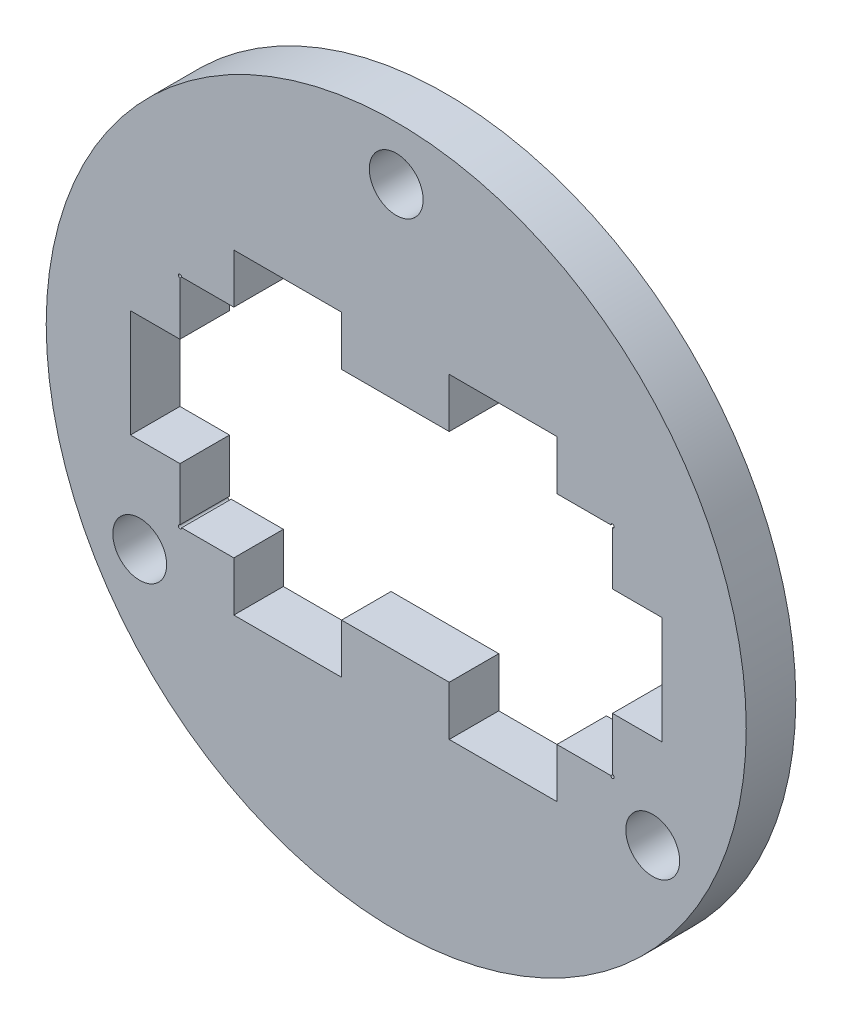
ISO-10303-21;
HEADER;
FILE_DESCRIPTION(('STEP AP214'),'2;1');
FILE_NAME('part.step','',(''),(''),'','','');
FILE_SCHEMA(('AUTOMOTIVE_DESIGN { 1 0 10303 214 1 1 1 1 }'));
ENDSEC;
DATA;
#1=APPLICATION_CONTEXT('core data for automotive mechanical design processes');
#2=APPLICATION_PROTOCOL_DEFINITION('international standard','automotive_design',2000,#1);
#3=PRODUCT_CONTEXT('',#1,'mechanical');
#4=PRODUCT('Part','Part','',(#3));
#5=PRODUCT_RELATED_PRODUCT_CATEGORY('part','',(#4));
#6=PRODUCT_DEFINITION_FORMATION('','',#4);
#7=PRODUCT_DEFINITION_CONTEXT('part definition',#1,'design');
#8=PRODUCT_DEFINITION('design','',#6,#7);
#9=PRODUCT_DEFINITION_SHAPE('','',#8);
#10=(LENGTH_UNIT() NAMED_UNIT(*) SI_UNIT(.MILLI.,.METRE.));
#11=(NAMED_UNIT(*) PLANE_ANGLE_UNIT() SI_UNIT($,.RADIAN.));
#12=(NAMED_UNIT(*) SI_UNIT($,.STERADIAN.) SOLID_ANGLE_UNIT());
#13=UNCERTAINTY_MEASURE_WITH_UNIT(LENGTH_MEASURE(1.E-05),#10,'distance_accuracy_value','');
#14=(GEOMETRIC_REPRESENTATION_CONTEXT(3) GLOBAL_UNCERTAINTY_ASSIGNED_CONTEXT((#13)) GLOBAL_UNIT_ASSIGNED_CONTEXT((#10,
#11,#12)) REPRESENTATION_CONTEXT('',''));
#15=CARTESIAN_POINT('',(0.,0.,0.));
#16=DIRECTION('',(0.,0.,1.));
#17=DIRECTION('',(1.,0.,0.));
#18=AXIS2_PLACEMENT_3D('',#15,#16,#17);
#19=CARTESIAN_POINT('',(-25.5,0.,5.842));
#20=DIRECTION('',(-1.,0.,0.));
#21=DIRECTION('',(0.,0.,1.));
#22=AXIS2_PLACEMENT_3D('',#19,#20,#21);
#23=PLANE('',#22);
#24=DIRECTION('',(0.,1.,0.));
#25=VECTOR('',#24,1.);
#26=CARTESIAN_POINT('',(-25.5,0.,0.));
#27=LINE('',#26,#25);
#28=CARTESIAN_POINT('',(-25.5,-12.6015625,0.));
#29=VERTEX_POINT('',#28);
#30=CARTESIAN_POINT('',(-25.5,-6.34999999999999,0.));
#31=VERTEX_POINT('',#30);
#32=EDGE_CURVE('E458',#29,#31,#27,.T.);
#33=ORIENTED_EDGE('',*,*,#32,.T.);
#34=DIRECTION('',(0.,0.,-1.));
#35=VECTOR('',#34,1.);
#36=CARTESIAN_POINT('',(-25.5,-6.34999999999999,5.842));
#37=LINE('',#36,#35);
#38=CARTESIAN_POINT('',(-25.5,-6.34999999999999,5.842));
#39=VERTEX_POINT('',#38);
#40=EDGE_CURVE('E284',#39,#31,#37,.T.);
#41=ORIENTED_EDGE('',*,*,#40,.F.);
#42=DIRECTION('',(0.,1.,0.));
#43=VECTOR('',#42,1.);
#44=CARTESIAN_POINT('',(-25.5,0.,5.842));
#45=LINE('',#44,#43);
#46=CARTESIAN_POINT('',(-25.5,-12.6015625,5.842));
#47=VERTEX_POINT('',#46);
#48=EDGE_CURVE('E420',#47,#39,#45,.T.);
#49=ORIENTED_EDGE('',*,*,#48,.F.);
#50=DIRECTION('',(0.,0.,-1.));
#51=VECTOR('',#50,1.);
#52=CARTESIAN_POINT('',(-25.5,-12.6015625,5.842));
#53=LINE('',#52,#51);
#54=EDGE_CURVE('E11',#47,#29,#53,.T.);
#55=ORIENTED_EDGE('',*,*,#54,.T.);
#56=EDGE_LOOP('',(#33,#41,#49,#55));
#57=FACE_BOUND('',#56,.T.);
#58=ADVANCED_FACE('F41',(#57),#23,.F.);
#59=CARTESIAN_POINT('',(25.5,0.,5.842));
#60=DIRECTION('',(-1.,0.,0.));
#61=DIRECTION('',(0.,0.,1.));
#62=AXIS2_PLACEMENT_3D('',#59,#60,#61);
#63=PLANE('',#62);
#64=DIRECTION('',(0.,0.,-1.));
#65=VECTOR('',#64,1.);
#66=CARTESIAN_POINT('',(25.5,-6.35,5.842));
#67=LINE('',#66,#65);
#68=CARTESIAN_POINT('',(25.5,-6.35,5.842));
#69=VERTEX_POINT('',#68);
#70=CARTESIAN_POINT('',(25.5,-6.35,0.));
#71=VERTEX_POINT('',#70);
#72=EDGE_CURVE('E302',#69,#71,#67,.T.);
#73=ORIENTED_EDGE('',*,*,#72,.T.);
#74=DIRECTION('',(0.,1.,0.));
#75=VECTOR('',#74,1.);
#76=CARTESIAN_POINT('',(25.5,0.,0.));
#77=LINE('',#76,#75);
#78=CARTESIAN_POINT('',(25.5,-12.6015625,0.));
#79=VERTEX_POINT('',#78);
#80=EDGE_CURVE('E473',#79,#71,#77,.T.);
#81=ORIENTED_EDGE('',*,*,#80,.F.);
#82=DIRECTION('',(0.,0.,-1.));
#83=VECTOR('',#82,1.);
#84=CARTESIAN_POINT('',(25.5,-12.6015625,5.842));
#85=LINE('',#84,#83);
#86=CARTESIAN_POINT('',(25.5,-12.6015625,5.842));
#87=VERTEX_POINT('',#86);
#88=EDGE_CURVE('E496',#87,#79,#85,.T.);
#89=ORIENTED_EDGE('',*,*,#88,.F.);
#90=DIRECTION('',(0.,1.,0.));
#91=VECTOR('',#90,1.);
#92=CARTESIAN_POINT('',(25.5,0.,5.842));
#93=LINE('',#92,#91);
#94=EDGE_CURVE('E434',#87,#69,#93,.T.);
#95=ORIENTED_EDGE('',*,*,#94,.T.);
#96=EDGE_LOOP('',(#73,#81,#89,#95));
#97=FACE_BOUND('',#96,.T.);
#98=ADVANCED_FACE('F533',(#97),#63,.T.);
#99=CARTESIAN_POINT('',(0.,-12.8,5.842));
#100=DIRECTION('',(0.,1.,0.));
#101=DIRECTION('',(0.,0.,1.));
#102=AXIS2_PLACEMENT_3D('',#99,#100,#101);
#103=PLANE('',#102);
#104=DIRECTION('',(0.,0.,-1.));
#105=VECTOR('',#104,1.);
#106=CARTESIAN_POINT('',(18.9499969420604,-12.8,5.842));
#107=LINE('',#106,#105);
#108=CARTESIAN_POINT('',(18.9499969420604,-12.8,5.842));
#109=VERTEX_POINT('',#108);
#110=CARTESIAN_POINT('',(18.9499969420604,-12.8,0.));
#111=VERTEX_POINT('',#110);
#112=EDGE_CURVE('E328',#109,#111,#107,.T.);
#113=ORIENTED_EDGE('',*,*,#112,.F.);
#114=DIRECTION('',(1.,0.,0.));
#115=VECTOR('',#114,1.);
#116=CARTESIAN_POINT('',(0.,-12.8,5.842));
#117=LINE('',#116,#115);
#118=CARTESIAN_POINT('',(25.3015625,-12.8,5.842));
#119=VERTEX_POINT('',#118);
#120=EDGE_CURVE('E440',#109,#119,#117,.T.);
#121=ORIENTED_EDGE('',*,*,#120,.T.);
#122=DIRECTION('',(0.,0.,-1.));
#123=VECTOR('',#122,1.);
#124=CARTESIAN_POINT('',(25.3015625,-12.8,5.842));
#125=LINE('',#124,#123);
#126=CARTESIAN_POINT('',(25.3015625,-12.8,0.));
#127=VERTEX_POINT('',#126);
#128=EDGE_CURVE('E493',#119,#127,#125,.T.);
#129=ORIENTED_EDGE('',*,*,#128,.T.);
#130=DIRECTION('',(1.,0.,0.));
#131=VECTOR('',#130,1.);
#132=CARTESIAN_POINT('',(0.,-12.8,0.));
#133=LINE('',#132,#131);
#134=EDGE_CURVE('E479',#111,#127,#133,.T.);
#135=ORIENTED_EDGE('',*,*,#134,.F.);
#136=EDGE_LOOP('',(#113,#121,#129,#135));
#137=FACE_BOUND('',#136,.T.);
#138=ADVANCED_FACE('F538',(#137),#103,.T.);
#139=CARTESIAN_POINT('',(0.,12.8,5.842));
#140=DIRECTION('',(0.,1.,0.));
#141=DIRECTION('',(0.,0.,1.));
#142=AXIS2_PLACEMENT_3D('',#139,#140,#141);
#143=PLANE('',#142);
#144=DIRECTION('',(1.,0.,0.));
#145=VECTOR('',#144,1.);
#146=CARTESIAN_POINT('',(0.,12.8,0.));
#147=LINE('',#146,#145);
#148=CARTESIAN_POINT('',(-6.45000305793958,12.8,0.));
#149=VERTEX_POINT('',#148);
#150=CARTESIAN_POINT('',(6.24999694206041,12.8,0.));
#151=VERTEX_POINT('',#150);
#152=EDGE_CURVE('E469',#149,#151,#147,.T.);
#153=ORIENTED_EDGE('',*,*,#152,.T.);
#154=DIRECTION('',(0.,0.,-1.));
#155=VECTOR('',#154,1.);
#156=CARTESIAN_POINT('',(6.24999694206041,12.8,5.842));
#157=LINE('',#156,#155);
#158=CARTESIAN_POINT('',(6.24999694206041,12.8,5.842));
#159=VERTEX_POINT('',#158);
#160=EDGE_CURVE('E354',#159,#151,#157,.T.);
#161=ORIENTED_EDGE('',*,*,#160,.F.);
#162=DIRECTION('',(1.,0.,0.));
#163=VECTOR('',#162,1.);
#164=CARTESIAN_POINT('',(0.,12.8,5.842));
#165=LINE('',#164,#163);
#166=CARTESIAN_POINT('',(-6.45000305793958,12.8,5.842));
#167=VERTEX_POINT('',#166);
#168=EDGE_CURVE('E430',#167,#159,#165,.T.);
#169=ORIENTED_EDGE('',*,*,#168,.F.);
#170=DIRECTION('',(0.,0.,-1.));
#171=VECTOR('',#170,1.);
#172=CARTESIAN_POINT('',(-6.45000305793958,12.8,5.842));
#173=LINE('',#172,#171);
#174=EDGE_CURVE('E409',#167,#149,#173,.T.);
#175=ORIENTED_EDGE('',*,*,#174,.T.);
#176=EDGE_LOOP('',(#153,#161,#169,#175));
#177=FACE_BOUND('',#176,.T.);
#178=ADVANCED_FACE('F611',(#177),#143,.F.);
#179=DIRECTION('',(0.,0.,-1.));
#180=VECTOR('',#179,1.);
#181=CARTESIAN_POINT('',(-19.1500030579396,-12.8,5.842));
#182=LINE('',#181,#180);
#183=CARTESIAN_POINT('',(-19.1500030579396,-12.8,5.842));
#184=VERTEX_POINT('',#183);
#185=CARTESIAN_POINT('',(-19.1500030579396,-12.8,0.));
#186=VERTEX_POINT('',#185);
#187=EDGE_CURVE('E373',#184,#186,#182,.T.);
#188=ORIENTED_EDGE('',*,*,#187,.T.);
#189=CARTESIAN_POINT('',(-25.3015625,-12.8,0.));
#190=VERTEX_POINT('',#189);
#191=EDGE_CURVE('E480',#190,#186,#133,.T.);
#192=ORIENTED_EDGE('',*,*,#191,.F.);
#193=DIRECTION('',(0.,0.,-1.));
#194=VECTOR('',#193,1.);
#195=CARTESIAN_POINT('',(-25.3015625,-12.8,5.842));
#196=LINE('',#195,#194);
#197=CARTESIAN_POINT('',(-25.3015625,-12.8,5.842));
#198=VERTEX_POINT('',#197);
#199=EDGE_CURVE('E454',#198,#190,#196,.T.);
#200=ORIENTED_EDGE('',*,*,#199,.F.);
#201=EDGE_CURVE('E441',#198,#184,#117,.T.);
#202=ORIENTED_EDGE('',*,*,#201,.T.);
#203=EDGE_LOOP('',(#188,#192,#200,#202));
#204=FACE_BOUND('',#203,.T.);
#205=ADVANCED_FACE('F551',(#204),#103,.T.);
#206=CARTESIAN_POINT('',(-25.3015625,12.8,0.));
#207=VERTEX_POINT('',#206);
#208=CARTESIAN_POINT('',(-19.1500030579396,12.8,0.));
#209=VERTEX_POINT('',#208);
#210=EDGE_CURVE('E465',#207,#209,#147,.T.);
#211=ORIENTED_EDGE('',*,*,#210,.T.);
#212=DIRECTION('',(0.,0.,-1.));
#213=VECTOR('',#212,1.);
#214=CARTESIAN_POINT('',(-19.1500030579396,12.8,5.842));
#215=LINE('',#214,#213);
#216=CARTESIAN_POINT('',(-19.1500030579396,12.8,5.842));
#217=VERTEX_POINT('',#216);
#218=EDGE_CURVE('E406',#217,#209,#215,.T.);
#219=ORIENTED_EDGE('',*,*,#218,.F.);
#220=CARTESIAN_POINT('',(-25.3015625,12.8,5.842));
#221=VERTEX_POINT('',#220);
#222=EDGE_CURVE('E426',#221,#217,#165,.T.);
#223=ORIENTED_EDGE('',*,*,#222,.F.);
#224=DIRECTION('',(0.,0.,-1.));
#225=VECTOR('',#224,1.);
#226=CARTESIAN_POINT('',(-25.3015625,12.8,5.842));
#227=LINE('',#226,#225);
#228=EDGE_CURVE('E504',#221,#207,#227,.T.);
#229=ORIENTED_EDGE('',*,*,#228,.T.);
#230=EDGE_LOOP('',(#211,#219,#223,#229));
#231=FACE_BOUND('',#230,.T.);
#232=ADVANCED_FACE('F521',(#231),#143,.F.);
#233=CARTESIAN_POINT('',(0.,0.,5.842));
#234=DIRECTION('',(0.,0.,1.));
#235=DIRECTION('',(1.,0.,0.));
#236=AXIS2_PLACEMENT_3D('',#233,#234,#235);
#237=PLANE('',#236);
#238=DIRECTION('',(-1.,0.,0.));
#239=VECTOR('',#238,1.);
#240=CARTESIAN_POINT('',(-31.342,-6.34999999999999,5.842));
#241=LINE('',#240,#239);
#242=CARTESIAN_POINT('',(-31.342,-6.34999999999999,5.842));
#243=VERTEX_POINT('',#242);
#244=EDGE_CURVE('E258',#39,#243,#241,.T.);
#245=ORIENTED_EDGE('',*,*,#244,.T.);
#246=DIRECTION('',(0.,1.,0.));
#247=VECTOR('',#246,1.);
#248=CARTESIAN_POINT('',(-31.342,-6.34999999999999,5.842));
#249=LINE('',#248,#247);
#250=CARTESIAN_POINT('',(-31.342,6.35,5.842));
#251=VERTEX_POINT('',#250);
#252=EDGE_CURVE('E253',#243,#251,#249,.T.);
#253=ORIENTED_EDGE('',*,*,#252,.T.);
#254=DIRECTION('',(1.,0.,0.));
#255=VECTOR('',#254,1.);
#256=CARTESIAN_POINT('',(-31.342,6.35,5.842));
#257=LINE('',#256,#255);
#258=CARTESIAN_POINT('',(-25.5,6.35,5.842));
#259=VERTEX_POINT('',#258);
#260=EDGE_CURVE('E261',#251,#259,#257,.T.);
#261=ORIENTED_EDGE('',*,*,#260,.T.);
#262=CARTESIAN_POINT('',(-25.5,12.6015625,5.842));
#263=VERTEX_POINT('',#262);
#264=EDGE_CURVE('E418',#259,#263,#45,.T.);
#265=ORIENTED_EDGE('',*,*,#264,.T.);
#266=CARTESIAN_POINT('',(-25.5,12.8,5.842));
#267=DIRECTION('',(0.,0.,1.));
#268=DIRECTION('',(1.,0.,0.));
#269=AXIS2_PLACEMENT_3D('',#266,#267,#268);
#270=CIRCLE('',#269,0.198437499999999);
#271=EDGE_CURVE('E422',#221,#263,#270,.T.);
#272=ORIENTED_EDGE('',*,*,#271,.F.);
#273=ORIENTED_EDGE('',*,*,#222,.T.);
#274=DIRECTION('',(0.,1.,0.));
#275=VECTOR('',#274,1.);
#276=CARTESIAN_POINT('',(-19.1500030579396,12.8,5.842));
#277=LINE('',#276,#275);
#278=CARTESIAN_POINT('',(-19.1500030579396,18.642,5.842));
#279=VERTEX_POINT('',#278);
#280=EDGE_CURVE('E389',#217,#279,#277,.T.);
#281=ORIENTED_EDGE('',*,*,#280,.T.);
#282=DIRECTION('',(1.,0.,0.));
#283=VECTOR('',#282,1.);
#284=CARTESIAN_POINT('',(-19.1500030579396,18.642,5.842));
#285=LINE('',#284,#283);
#286=CARTESIAN_POINT('',(-6.45000305793958,18.642,5.842));
#287=VERTEX_POINT('',#286);
#288=EDGE_CURVE('E392',#279,#287,#285,.T.);
#289=ORIENTED_EDGE('',*,*,#288,.T.);
#290=DIRECTION('',(0.,-1.,0.));
#291=VECTOR('',#290,1.);
#292=CARTESIAN_POINT('',(-6.45000305793958,12.8,5.842));
#293=LINE('',#292,#291);
#294=EDGE_CURVE('E396',#287,#167,#293,.T.);
#295=ORIENTED_EDGE('',*,*,#294,.T.);
#296=ORIENTED_EDGE('',*,*,#168,.T.);
#297=DIRECTION('',(0.,1.,0.));
#298=VECTOR('',#297,1.);
#299=CARTESIAN_POINT('',(6.24999694206041,12.8,5.842));
#300=LINE('',#299,#298);
#301=CARTESIAN_POINT('',(6.24999694206041,18.642,5.842));
#302=VERTEX_POINT('',#301);
#303=EDGE_CURVE('E337',#159,#302,#300,.T.);
#304=ORIENTED_EDGE('',*,*,#303,.T.);
#305=DIRECTION('',(1.,0.,0.));
#306=VECTOR('',#305,1.);
#307=CARTESIAN_POINT('',(18.9499969420604,18.642,5.842));
#308=LINE('',#307,#306);
#309=CARTESIAN_POINT('',(18.9499969420604,18.642,5.842));
#310=VERTEX_POINT('',#309);
#311=EDGE_CURVE('E340',#302,#310,#308,.T.);
#312=ORIENTED_EDGE('',*,*,#311,.T.);
#313=DIRECTION('',(0.,-1.,0.));
#314=VECTOR('',#313,1.);
#315=CARTESIAN_POINT('',(18.9499969420604,12.8,5.842));
#316=LINE('',#315,#314);
#317=CARTESIAN_POINT('',(18.9499969420604,12.8,5.842));
#318=VERTEX_POINT('',#317);
#319=EDGE_CURVE('E344',#310,#318,#316,.T.);
#320=ORIENTED_EDGE('',*,*,#319,.T.);
#321=CARTESIAN_POINT('',(25.3015625,12.8,5.842));
#322=VERTEX_POINT('',#321);
#323=EDGE_CURVE('E425',#318,#322,#165,.T.);
#324=ORIENTED_EDGE('',*,*,#323,.T.);
#325=CARTESIAN_POINT('',(25.5,12.8,5.842));
#326=DIRECTION('',(0.,0.,1.));
#327=DIRECTION('',(1.,0.,0.));
#328=AXIS2_PLACEMENT_3D('',#325,#326,#327);
#329=CIRCLE('',#328,0.198437499999999);
#330=CARTESIAN_POINT('',(25.5,12.6015625,5.842));
#331=VERTEX_POINT('',#330);
#332=EDGE_CURVE('E429',#331,#322,#329,.T.);
#333=ORIENTED_EDGE('',*,*,#332,.F.);
#334=CARTESIAN_POINT('',(25.5,6.35,5.842));
#335=VERTEX_POINT('',#334);
#336=EDGE_CURVE('E433',#335,#331,#93,.T.);
#337=ORIENTED_EDGE('',*,*,#336,.F.);
#338=DIRECTION('',(1.,0.,0.));
#339=VECTOR('',#338,1.);
#340=CARTESIAN_POINT('',(31.342,6.35,5.842));
#341=LINE('',#340,#339);
#342=CARTESIAN_POINT('',(31.342,6.35,5.842));
#343=VERTEX_POINT('',#342);
#344=EDGE_CURVE('E64',#335,#343,#341,.T.);
#345=ORIENTED_EDGE('',*,*,#344,.T.);
#346=DIRECTION('',(0.,-1.,0.));
#347=VECTOR('',#346,1.);
#348=CARTESIAN_POINT('',(31.342,-6.35,5.842));
#349=LINE('',#348,#347);
#350=CARTESIAN_POINT('',(31.342,-6.35,5.842));
#351=VERTEX_POINT('',#350);
#352=EDGE_CURVE('E288',#343,#351,#349,.T.);
#353=ORIENTED_EDGE('',*,*,#352,.T.);
#354=DIRECTION('',(-1.,0.,0.));
#355=VECTOR('',#354,1.);
#356=CARTESIAN_POINT('',(31.342,-6.35,5.842));
#357=LINE('',#356,#355);
#358=EDGE_CURVE('E292',#351,#69,#357,.T.);
#359=ORIENTED_EDGE('',*,*,#358,.T.);
#360=ORIENTED_EDGE('',*,*,#94,.F.);
#361=CARTESIAN_POINT('',(25.5,-12.8,5.842));
#362=DIRECTION('',(0.,0.,1.));
#363=DIRECTION('',(1.,0.,0.));
#364=AXIS2_PLACEMENT_3D('',#361,#362,#363);
#365=CIRCLE('',#364,0.198437499999999);
#366=EDGE_CURVE('E437',#119,#87,#365,.T.);
#367=ORIENTED_EDGE('',*,*,#366,.F.);
#368=ORIENTED_EDGE('',*,*,#120,.F.);
#369=DIRECTION('',(0.,-1.,0.));
#370=VECTOR('',#369,1.);
#371=CARTESIAN_POINT('',(18.9499969420604,-12.8,5.842));
#372=LINE('',#371,#370);
#373=CARTESIAN_POINT('',(18.9499969420604,-18.642,5.842));
#374=VERTEX_POINT('',#373);
#375=EDGE_CURVE('E311',#109,#374,#372,.T.);
#376=ORIENTED_EDGE('',*,*,#375,.T.);
#377=DIRECTION('',(-1.,0.,0.));
#378=VECTOR('',#377,1.);
#379=CARTESIAN_POINT('',(18.9499969420604,-18.642,5.842));
#380=LINE('',#379,#378);
#381=CARTESIAN_POINT('',(6.24999694206041,-18.642,5.842));
#382=VERTEX_POINT('',#381);
#383=EDGE_CURVE('E314',#374,#382,#380,.T.);
#384=ORIENTED_EDGE('',*,*,#383,.T.);
#385=DIRECTION('',(0.,1.,0.));
#386=VECTOR('',#385,1.);
#387=CARTESIAN_POINT('',(6.24999694206041,-12.8,5.842));
#388=LINE('',#387,#386);
#389=CARTESIAN_POINT('',(6.24999694206041,-12.8,5.842));
#390=VERTEX_POINT('',#389);
#391=EDGE_CURVE('E318',#382,#390,#388,.T.);
#392=ORIENTED_EDGE('',*,*,#391,.T.);
#393=CARTESIAN_POINT('',(-6.45000305793958,-12.8,5.842));
#394=VERTEX_POINT('',#393);
#395=EDGE_CURVE('E445',#394,#390,#117,.T.);
#396=ORIENTED_EDGE('',*,*,#395,.F.);
#397=DIRECTION('',(0.,-1.,0.));
#398=VECTOR('',#397,1.);
#399=CARTESIAN_POINT('',(-6.45000305793958,-12.8,5.842));
#400=LINE('',#399,#398);
#401=CARTESIAN_POINT('',(-6.45000305793958,-18.642,5.842));
#402=VERTEX_POINT('',#401);
#403=EDGE_CURVE('E366',#394,#402,#400,.T.);
#404=ORIENTED_EDGE('',*,*,#403,.T.);
#405=DIRECTION('',(-1.,0.,0.));
#406=VECTOR('',#405,1.);
#407=CARTESIAN_POINT('',(-19.1500030579396,-18.642,5.842));
#408=LINE('',#407,#406);
#409=CARTESIAN_POINT('',(-19.1500030579396,-18.642,5.842));
#410=VERTEX_POINT('',#409);
#411=EDGE_CURVE('E370',#402,#410,#408,.T.);
#412=ORIENTED_EDGE('',*,*,#411,.T.);
#413=DIRECTION('',(0.,1.,0.));
#414=VECTOR('',#413,1.);
#415=CARTESIAN_POINT('',(-19.1500030579396,-12.8,5.842));
#416=LINE('',#415,#414);
#417=EDGE_CURVE('E363',#410,#184,#416,.T.);
#418=ORIENTED_EDGE('',*,*,#417,.T.);
#419=ORIENTED_EDGE('',*,*,#201,.F.);
#420=CARTESIAN_POINT('',(-25.5,-12.8,5.842));
#421=DIRECTION('',(0.,0.,1.));
#422=DIRECTION('',(1.,0.,0.));
#423=AXIS2_PLACEMENT_3D('',#420,#421,#422);
#424=CIRCLE('',#423,0.198437499999999);
#425=EDGE_CURVE('E415',#47,#198,#424,.T.);
#426=ORIENTED_EDGE('',*,*,#425,.F.);
#427=ORIENTED_EDGE('',*,*,#48,.T.);
#428=EDGE_LOOP('',(#245,#253,#261,#265,#272,#273,#281,#289,#295,#296,#304,#312,#320,#324,#333,
#337,#345,#353,#359,#360,#367,#368,#376,#384,#392,#396,#404,#412,#418,#419,#426,#427));
#429=FACE_BOUND('',#428,.T.);
#430=CARTESIAN_POINT('',(30.2459372271715,-17.4625,5.842));
#431=DIRECTION('',(0.,0.,1.));
#432=DIRECTION('',(1.,0.,0.));
#433=AXIS2_PLACEMENT_3D('',#430,#431,#432);
#434=CIRCLE('',#433,3.175);
#435=CARTESIAN_POINT('',(33.4209372271715,-17.4625,5.842));
#436=VERTEX_POINT('',#435);
#437=EDGE_CURVE('E451',#436,#436,#434,.T.);
#438=ORIENTED_EDGE('',*,*,#437,.F.);
#439=EDGE_LOOP('',(#438));
#440=FACE_BOUND('',#439,.T.);
#441=CARTESIAN_POINT('',(0.,34.925,5.842));
#442=DIRECTION('',(0.,0.,1.));
#443=DIRECTION('',(1.,0.,0.));
#444=AXIS2_PLACEMENT_3D('',#441,#442,#443);
#445=CIRCLE('',#444,3.175);
#446=CARTESIAN_POINT('',(3.17499999999999,34.925,5.842));
#447=VERTEX_POINT('',#446);
#448=EDGE_CURVE('E448',#447,#447,#445,.T.);
#449=ORIENTED_EDGE('',*,*,#448,.F.);
#450=EDGE_LOOP('',(#449));
#451=FACE_BOUND('',#450,.T.);
#452=CARTESIAN_POINT('',(-30.2459372271715,-17.4625,5.842));
#453=DIRECTION('',(0.,0.,1.));
#454=DIRECTION('',(1.,0.,0.));
#455=AXIS2_PLACEMENT_3D('',#452,#453,#454);
#456=CIRCLE('',#455,3.175);
#457=CARTESIAN_POINT('',(-27.0709372271715,-17.4625,5.842));
#458=VERTEX_POINT('',#457);
#459=EDGE_CURVE('E444',#458,#458,#456,.T.);
#460=ORIENTED_EDGE('',*,*,#459,.F.);
#461=EDGE_LOOP('',(#460));
#462=FACE_BOUND('',#461,.T.);
#463=CARTESIAN_POINT('',(0.,0.,5.842));
#464=DIRECTION('',(0.,0.,-1.));
#465=DIRECTION('',(-1.,0.,0.));
#466=AXIS2_PLACEMENT_3D('',#463,#464,#465);
#467=CIRCLE('',#466,41.275);
#468=CARTESIAN_POINT('',(-41.275,0.,5.842));
#469=VERTEX_POINT('',#468);
#470=EDGE_CURVE('E279',#469,#469,#467,.T.);
#471=ORIENTED_EDGE('',*,*,#470,.F.);
#472=EDGE_LOOP('',(#471));
#473=FACE_BOUND('',#472,.T.);
#474=ADVANCED_FACE('F266',(#429,#440,#451,#462,#473),#237,.T.);
#475=CARTESIAN_POINT('',(0.,0.,0.));
#476=DIRECTION('',(0.,0.,1.));
#477=DIRECTION('',(1.,0.,0.));
#478=AXIS2_PLACEMENT_3D('',#475,#476,#477);
#479=PLANE('',#478);
#480=CARTESIAN_POINT('',(30.2459372271715,-17.4625,0.));
#481=DIRECTION('',(0.,0.,1.));
#482=DIRECTION('',(1.,0.,0.));
#483=AXIS2_PLACEMENT_3D('',#480,#481,#482);
#484=CIRCLE('',#483,3.175);
#485=CARTESIAN_POINT('',(33.4209372271715,-17.4625,0.));
#486=VERTEX_POINT('',#485);
#487=EDGE_CURVE('E419',#486,#486,#484,.T.);
#488=ORIENTED_EDGE('',*,*,#487,.T.);
#489=EDGE_LOOP('',(#488));
#490=FACE_BOUND('',#489,.T.);
#491=CARTESIAN_POINT('',(0.,34.925,0.));
#492=DIRECTION('',(0.,0.,1.));
#493=DIRECTION('',(1.,0.,0.));
#494=AXIS2_PLACEMENT_3D('',#491,#492,#493);
#495=CIRCLE('',#494,3.175);
#496=CARTESIAN_POINT('',(3.17499999999999,34.925,0.));
#497=VERTEX_POINT('',#496);
#498=EDGE_CURVE('E487',#497,#497,#495,.T.);
#499=ORIENTED_EDGE('',*,*,#498,.T.);
#500=EDGE_LOOP('',(#499));
#501=FACE_BOUND('',#500,.T.);
#502=CARTESIAN_POINT('',(-30.2459372271715,-17.4625,0.));
#503=DIRECTION('',(0.,0.,1.));
#504=DIRECTION('',(1.,0.,0.));
#505=AXIS2_PLACEMENT_3D('',#502,#503,#504);
#506=CIRCLE('',#505,3.175);
#507=CARTESIAN_POINT('',(-27.0709372271715,-17.4625,0.));
#508=VERTEX_POINT('',#507);
#509=EDGE_CURVE('E483',#508,#508,#506,.T.);
#510=ORIENTED_EDGE('',*,*,#509,.T.);
#511=EDGE_LOOP('',(#510));
#512=FACE_BOUND('',#511,.T.);
#513=DIRECTION('',(0.,1.,0.));
#514=VECTOR('',#513,1.);
#515=CARTESIAN_POINT('',(-31.342,-6.34999999999999,0.));
#516=LINE('',#515,#514);
#517=CARTESIAN_POINT('',(-31.342,-6.34999999999999,0.));
#518=VERTEX_POINT('',#517);
#519=CARTESIAN_POINT('',(-31.342,6.35,0.));
#520=VERTEX_POINT('',#519);
#521=EDGE_CURVE('E256',#518,#520,#516,.T.);
#522=ORIENTED_EDGE('',*,*,#521,.F.);
#523=DIRECTION('',(-1.,0.,0.));
#524=VECTOR('',#523,1.);
#525=CARTESIAN_POINT('',(-31.342,-6.34999999999999,0.));
#526=LINE('',#525,#524);
#527=EDGE_CURVE('E269',#31,#518,#526,.T.);
#528=ORIENTED_EDGE('',*,*,#527,.F.);
#529=ORIENTED_EDGE('',*,*,#32,.F.);
#530=CARTESIAN_POINT('',(-25.5,-12.8,0.));
#531=DIRECTION('',(0.,0.,1.));
#532=DIRECTION('',(1.,0.,0.));
#533=AXIS2_PLACEMENT_3D('',#530,#531,#532);
#534=CIRCLE('',#533,0.198437499999999);
#535=EDGE_CURVE('E408',#29,#190,#534,.T.);
#536=ORIENTED_EDGE('',*,*,#535,.T.);
#537=ORIENTED_EDGE('',*,*,#191,.T.);
#538=DIRECTION('',(0.,1.,0.));
#539=VECTOR('',#538,1.);
#540=CARTESIAN_POINT('',(-19.1500030579396,-12.8,0.));
#541=LINE('',#540,#539);
#542=CARTESIAN_POINT('',(-19.1500030579396,-18.642,0.));
#543=VERTEX_POINT('',#542);
#544=EDGE_CURVE('E356',#543,#186,#541,.T.);
#545=ORIENTED_EDGE('',*,*,#544,.F.);
#546=DIRECTION('',(-1.,0.,0.));
#547=VECTOR('',#546,1.);
#548=CARTESIAN_POINT('',(-19.1500030579396,-18.642,0.));
#549=LINE('',#548,#547);
#550=CARTESIAN_POINT('',(-6.45000305793958,-18.642,0.));
#551=VERTEX_POINT('',#550);
#552=EDGE_CURVE('E367',#551,#543,#549,.T.);
#553=ORIENTED_EDGE('',*,*,#552,.F.);
#554=DIRECTION('',(0.,-1.,0.));
#555=VECTOR('',#554,1.);
#556=CARTESIAN_POINT('',(-6.45000305793958,-12.8,0.));
#557=LINE('',#556,#555);
#558=CARTESIAN_POINT('',(-6.45000305793958,-12.8,0.));
#559=VERTEX_POINT('',#558);
#560=EDGE_CURVE('E375',#559,#551,#557,.T.);
#561=ORIENTED_EDGE('',*,*,#560,.F.);
#562=CARTESIAN_POINT('',(6.24999694206041,-12.8,0.));
#563=VERTEX_POINT('',#562);
#564=EDGE_CURVE('E484',#559,#563,#133,.T.);
#565=ORIENTED_EDGE('',*,*,#564,.T.);
#566=DIRECTION('',(0.,1.,0.));
#567=VECTOR('',#566,1.);
#568=CARTESIAN_POINT('',(6.24999694206041,-12.8,0.));
#569=LINE('',#568,#567);
#570=CARTESIAN_POINT('',(6.24999694206041,-18.642,0.));
#571=VERTEX_POINT('',#570);
#572=EDGE_CURVE('E315',#571,#563,#569,.T.);
#573=ORIENTED_EDGE('',*,*,#572,.F.);
#574=DIRECTION('',(-1.,0.,0.));
#575=VECTOR('',#574,1.);
#576=CARTESIAN_POINT('',(18.9499969420604,-18.642,0.));
#577=LINE('',#576,#575);
#578=CARTESIAN_POINT('',(18.9499969420604,-18.642,0.));
#579=VERTEX_POINT('',#578);
#580=EDGE_CURVE('E324',#579,#571,#577,.T.);
#581=ORIENTED_EDGE('',*,*,#580,.F.);
#582=DIRECTION('',(0.,-1.,0.));
#583=VECTOR('',#582,1.);
#584=CARTESIAN_POINT('',(18.9499969420604,-12.8,0.));
#585=LINE('',#584,#583);
#586=EDGE_CURVE('E305',#111,#579,#585,.T.);
#587=ORIENTED_EDGE('',*,*,#586,.F.);
#588=ORIENTED_EDGE('',*,*,#134,.T.);
#589=CARTESIAN_POINT('',(25.5,-12.8,0.));
#590=DIRECTION('',(0.,0.,1.));
#591=DIRECTION('',(1.,0.,0.));
#592=AXIS2_PLACEMENT_3D('',#589,#590,#591);
#593=CIRCLE('',#592,0.198437499999999);
#594=EDGE_CURVE('E476',#127,#79,#593,.T.);
#595=ORIENTED_EDGE('',*,*,#594,.T.);
#596=ORIENTED_EDGE('',*,*,#80,.T.);
#597=DIRECTION('',(-1.,0.,0.));
#598=VECTOR('',#597,1.);
#599=CARTESIAN_POINT('',(31.342,-6.35,0.));
#600=LINE('',#599,#598);
#601=CARTESIAN_POINT('',(31.342,-6.35,0.));
#602=VERTEX_POINT('',#601);
#603=EDGE_CURVE('E289',#602,#71,#600,.T.);
#604=ORIENTED_EDGE('',*,*,#603,.F.);
#605=DIRECTION('',(0.,-1.,0.));
#606=VECTOR('',#605,1.);
#607=CARTESIAN_POINT('',(31.342,-6.35,0.));
#608=LINE('',#607,#606);
#609=CARTESIAN_POINT('',(31.342,6.35,0.));
#610=VERTEX_POINT('',#609);
#611=EDGE_CURVE('E298',#610,#602,#608,.T.);
#612=ORIENTED_EDGE('',*,*,#611,.F.);
#613=DIRECTION('',(1.,0.,0.));
#614=VECTOR('',#613,1.);
#615=CARTESIAN_POINT('',(31.342,6.35,0.));
#616=LINE('',#615,#614);
#617=CARTESIAN_POINT('',(25.5,6.35,0.));
#618=VERTEX_POINT('',#617);
#619=EDGE_CURVE('E283',#618,#610,#616,.T.);
#620=ORIENTED_EDGE('',*,*,#619,.F.);
#621=CARTESIAN_POINT('',(25.5,12.6015625,0.));
#622=VERTEX_POINT('',#621);
#623=EDGE_CURVE('E472',#618,#622,#77,.T.);
#624=ORIENTED_EDGE('',*,*,#623,.T.);
#625=CARTESIAN_POINT('',(25.5,12.8,0.));
#626=DIRECTION('',(0.,0.,1.));
#627=DIRECTION('',(1.,0.,0.));
#628=AXIS2_PLACEMENT_3D('',#625,#626,#627);
#629=CIRCLE('',#628,0.198437499999999);
#630=CARTESIAN_POINT('',(25.3015625,12.8,0.));
#631=VERTEX_POINT('',#630);
#632=EDGE_CURVE('E468',#622,#631,#629,.T.);
#633=ORIENTED_EDGE('',*,*,#632,.T.);
#634=CARTESIAN_POINT('',(18.9499969420604,12.8,0.));
#635=VERTEX_POINT('',#634);
#636=EDGE_CURVE('E464',#635,#631,#147,.T.);
#637=ORIENTED_EDGE('',*,*,#636,.F.);
#638=DIRECTION('',(0.,-1.,0.));
#639=VECTOR('',#638,1.);
#640=CARTESIAN_POINT('',(18.9499969420604,12.8,0.));
#641=LINE('',#640,#639);
#642=CARTESIAN_POINT('',(18.9499969420604,18.642,0.));
#643=VERTEX_POINT('',#642);
#644=EDGE_CURVE('E341',#643,#635,#641,.T.);
#645=ORIENTED_EDGE('',*,*,#644,.F.);
#646=DIRECTION('',(1.,0.,0.));
#647=VECTOR('',#646,1.);
#648=CARTESIAN_POINT('',(18.9499969420604,18.642,0.));
#649=LINE('',#648,#647);
#650=CARTESIAN_POINT('',(6.24999694206041,18.642,0.));
#651=VERTEX_POINT('',#650);
#652=EDGE_CURVE('E350',#651,#643,#649,.T.);
#653=ORIENTED_EDGE('',*,*,#652,.F.);
#654=DIRECTION('',(0.,1.,0.));
#655=VECTOR('',#654,1.);
#656=CARTESIAN_POINT('',(6.24999694206041,12.8,0.));
#657=LINE('',#656,#655);
#658=EDGE_CURVE('E330',#151,#651,#657,.T.);
#659=ORIENTED_EDGE('',*,*,#658,.F.);
#660=ORIENTED_EDGE('',*,*,#152,.F.);
#661=DIRECTION('',(0.,-1.,0.));
#662=VECTOR('',#661,1.);
#663=CARTESIAN_POINT('',(-6.45000305793958,12.8,0.));
#664=LINE('',#663,#662);
#665=CARTESIAN_POINT('',(-6.45000305793958,18.642,0.));
#666=VERTEX_POINT('',#665);
#667=EDGE_CURVE('E393',#666,#149,#664,.T.);
#668=ORIENTED_EDGE('',*,*,#667,.F.);
#669=DIRECTION('',(1.,0.,0.));
#670=VECTOR('',#669,1.);
#671=CARTESIAN_POINT('',(-19.1500030579396,18.642,0.));
#672=LINE('',#671,#670);
#673=CARTESIAN_POINT('',(-19.1500030579396,18.642,0.));
#674=VERTEX_POINT('',#673);
#675=EDGE_CURVE('E402',#674,#666,#672,.T.);
#676=ORIENTED_EDGE('',*,*,#675,.F.);
#677=DIRECTION('',(0.,1.,0.));
#678=VECTOR('',#677,1.);
#679=CARTESIAN_POINT('',(-19.1500030579396,12.8,0.));
#680=LINE('',#679,#678);
#681=EDGE_CURVE('E382',#209,#674,#680,.T.);
#682=ORIENTED_EDGE('',*,*,#681,.F.);
#683=ORIENTED_EDGE('',*,*,#210,.F.);
#684=CARTESIAN_POINT('',(-25.5,12.8,0.));
#685=DIRECTION('',(0.,0.,1.));
#686=DIRECTION('',(1.,0.,0.));
#687=AXIS2_PLACEMENT_3D('',#684,#685,#686);
#688=CIRCLE('',#687,0.198437499999999);
#689=CARTESIAN_POINT('',(-25.5,12.6015625,0.));
#690=VERTEX_POINT('',#689);
#691=EDGE_CURVE('E461',#207,#690,#688,.T.);
#692=ORIENTED_EDGE('',*,*,#691,.T.);
#693=CARTESIAN_POINT('',(-25.5,6.35,0.));
#694=VERTEX_POINT('',#693);
#695=EDGE_CURVE('E457',#694,#690,#27,.T.);
#696=ORIENTED_EDGE('',*,*,#695,.F.);
#697=DIRECTION('',(1.,0.,0.));
#698=VECTOR('',#697,1.);
#699=CARTESIAN_POINT('',(-31.342,6.35,0.));
#700=LINE('',#699,#698);
#701=EDGE_CURVE('E56',#520,#694,#700,.T.);
#702=ORIENTED_EDGE('',*,*,#701,.F.);
#703=EDGE_LOOP('',(#522,#528,#529,#536,#537,#545,#553,#561,#565,#573,#581,#587,#588,#595,#596,
#604,#612,#620,#624,#633,#637,#645,#653,#659,#660,#668,#676,#682,#683,#692,#696,#702));
#704=FACE_BOUND('',#703,.T.);
#705=CARTESIAN_POINT('',(0.,0.,0.));
#706=DIRECTION('',(0.,0.,-1.));
#707=DIRECTION('',(-1.,0.,0.));
#708=AXIS2_PLACEMENT_3D('',#705,#706,#707);
#709=CIRCLE('',#708,41.275);
#710=CARTESIAN_POINT('',(-41.275,0.,0.));
#711=VERTEX_POINT('',#710);
#712=EDGE_CURVE('E274',#711,#711,#709,.T.);
#713=ORIENTED_EDGE('',*,*,#712,.T.);
#714=EDGE_LOOP('',(#713));
#715=FACE_BOUND('',#714,.T.);
#716=ADVANCED_FACE('F515',(#490,#501,#512,#704,#715),#479,.F.);
#717=CARTESIAN_POINT('',(-25.5,-12.8,5.842));
#718=DIRECTION('',(0.,0.,-1.));
#719=DIRECTION('',(-1.,0.,0.));
#720=AXIS2_PLACEMENT_3D('',#717,#718,#719);
#721=CYLINDRICAL_SURFACE('',#720,0.198437499999999);
#722=ORIENTED_EDGE('',*,*,#535,.F.);
#723=ORIENTED_EDGE('',*,*,#54,.F.);
#724=ORIENTED_EDGE('',*,*,#425,.T.);
#725=ORIENTED_EDGE('',*,*,#199,.T.);
#726=EDGE_LOOP('',(#722,#723,#724,#725));
#727=FACE_BOUND('',#726,.T.);
#728=ADVANCED_FACE('F43',(#727),#721,.F.);
#729=ORIENTED_EDGE('',*,*,#264,.F.);
#730=DIRECTION('',(0.,0.,-1.));
#731=VECTOR('',#730,1.);
#732=CARTESIAN_POINT('',(-25.5,6.35,5.842));
#733=LINE('',#732,#731);
#734=EDGE_CURVE('E257',#259,#694,#733,.T.);
#735=ORIENTED_EDGE('',*,*,#734,.T.);
#736=ORIENTED_EDGE('',*,*,#695,.T.);
#737=DIRECTION('',(0.,0.,-1.));
#738=VECTOR('',#737,1.);
#739=CARTESIAN_POINT('',(-25.5,12.6015625,5.842));
#740=LINE('',#739,#738);
#741=EDGE_CURVE('E49',#263,#690,#740,.T.);
#742=ORIENTED_EDGE('',*,*,#741,.F.);
#743=EDGE_LOOP('',(#729,#735,#736,#742));
#744=FACE_BOUND('',#743,.T.);
#745=ADVANCED_FACE('F523',(#744),#23,.F.);
#746=CARTESIAN_POINT('',(-25.5,12.8,5.842));
#747=DIRECTION('',(0.,0.,-1.));
#748=DIRECTION('',(-1.,0.,0.));
#749=AXIS2_PLACEMENT_3D('',#746,#747,#748);
#750=CYLINDRICAL_SURFACE('',#749,0.198437499999999);
#751=ORIENTED_EDGE('',*,*,#691,.F.);
#752=ORIENTED_EDGE('',*,*,#228,.F.);
#753=ORIENTED_EDGE('',*,*,#271,.T.);
#754=ORIENTED_EDGE('',*,*,#741,.T.);
#755=EDGE_LOOP('',(#751,#752,#753,#754));
#756=FACE_BOUND('',#755,.T.);
#757=ADVANCED_FACE('F509',(#756),#750,.F.);
#758=ORIENTED_EDGE('',*,*,#323,.F.);
#759=DIRECTION('',(0.,0.,-1.));
#760=VECTOR('',#759,1.);
#761=CARTESIAN_POINT('',(18.9499969420604,12.8,5.842));
#762=LINE('',#761,#760);
#763=EDGE_CURVE('E357',#318,#635,#762,.T.);
#764=ORIENTED_EDGE('',*,*,#763,.T.);
#765=ORIENTED_EDGE('',*,*,#636,.T.);
#766=DIRECTION('',(0.,0.,-1.));
#767=VECTOR('',#766,1.);
#768=CARTESIAN_POINT('',(25.3015625,12.8,5.842));
#769=LINE('',#768,#767);
#770=EDGE_CURVE('E501',#322,#631,#769,.T.);
#771=ORIENTED_EDGE('',*,*,#770,.F.);
#772=EDGE_LOOP('',(#758,#764,#765,#771));
#773=FACE_BOUND('',#772,.T.);
#774=ADVANCED_FACE('F529',(#773),#143,.F.);
#775=CARTESIAN_POINT('',(25.5,12.8,5.842));
#776=DIRECTION('',(0.,0.,-1.));
#777=DIRECTION('',(-1.,0.,0.));
#778=AXIS2_PLACEMENT_3D('',#775,#776,#777);
#779=CYLINDRICAL_SURFACE('',#778,0.198437499999999);
#780=ORIENTED_EDGE('',*,*,#632,.F.);
#781=DIRECTION('',(0.,0.,-1.));
#782=VECTOR('',#781,1.);
#783=CARTESIAN_POINT('',(25.5,12.6015625,5.842));
#784=LINE('',#783,#782);
#785=EDGE_CURVE('E498',#331,#622,#784,.T.);
#786=ORIENTED_EDGE('',*,*,#785,.F.);
#787=ORIENTED_EDGE('',*,*,#332,.T.);
#788=ORIENTED_EDGE('',*,*,#770,.T.);
#789=EDGE_LOOP('',(#780,#786,#787,#788));
#790=FACE_BOUND('',#789,.T.);
#791=ADVANCED_FACE('F601',(#790),#779,.F.);
#792=DIRECTION('',(0.,0.,-1.));
#793=VECTOR('',#792,1.);
#794=CARTESIAN_POINT('',(25.5,6.35,5.842));
#795=LINE('',#794,#793);
#796=EDGE_CURVE('E295',#335,#618,#795,.T.);
#797=ORIENTED_EDGE('',*,*,#796,.F.);
#798=ORIENTED_EDGE('',*,*,#336,.T.);
#799=ORIENTED_EDGE('',*,*,#785,.T.);
#800=ORIENTED_EDGE('',*,*,#623,.F.);
#801=EDGE_LOOP('',(#797,#798,#799,#800));
#802=FACE_BOUND('',#801,.T.);
#803=ADVANCED_FACE('F541',(#802),#63,.T.);
#804=CARTESIAN_POINT('',(25.5,-12.8,5.842));
#805=DIRECTION('',(0.,0.,-1.));
#806=DIRECTION('',(-1.,0.,0.));
#807=AXIS2_PLACEMENT_3D('',#804,#805,#806);
#808=CYLINDRICAL_SURFACE('',#807,0.198437499999999);
#809=ORIENTED_EDGE('',*,*,#594,.F.);
#810=ORIENTED_EDGE('',*,*,#128,.F.);
#811=ORIENTED_EDGE('',*,*,#366,.T.);
#812=ORIENTED_EDGE('',*,*,#88,.T.);
#813=EDGE_LOOP('',(#809,#810,#811,#812));
#814=FACE_BOUND('',#813,.T.);
#815=ADVANCED_FACE('F581',(#814),#808,.F.);
#816=CARTESIAN_POINT('',(30.2459372271715,-17.4625,5.842));
#817=DIRECTION('',(0.,0.,-1.));
#818=DIRECTION('',(-1.,0.,0.));
#819=AXIS2_PLACEMENT_3D('',#816,#817,#818);
#820=CYLINDRICAL_SURFACE('',#819,3.175);
#821=ORIENTED_EDGE('',*,*,#437,.T.);
#822=EDGE_LOOP('',(#821));
#823=FACE_BOUND('',#822,.T.);
#824=ORIENTED_EDGE('',*,*,#487,.F.);
#825=EDGE_LOOP('',(#824));
#826=FACE_BOUND('',#825,.T.);
#827=ADVANCED_FACE('F886',(#823,#826),#820,.F.);
#828=CARTESIAN_POINT('',(0.,34.925,5.842));
#829=DIRECTION('',(0.,0.,-1.));
#830=DIRECTION('',(-1.,0.,0.));
#831=AXIS2_PLACEMENT_3D('',#828,#829,#830);
#832=CYLINDRICAL_SURFACE('',#831,3.175);
#833=ORIENTED_EDGE('',*,*,#448,.T.);
#834=EDGE_LOOP('',(#833));
#835=FACE_BOUND('',#834,.T.);
#836=ORIENTED_EDGE('',*,*,#498,.F.);
#837=EDGE_LOOP('',(#836));
#838=FACE_BOUND('',#837,.T.);
#839=ADVANCED_FACE('F889',(#835,#838),#832,.F.);
#840=CARTESIAN_POINT('',(-30.2459372271715,-17.4625,5.842));
#841=DIRECTION('',(0.,0.,-1.));
#842=DIRECTION('',(-1.,0.,0.));
#843=AXIS2_PLACEMENT_3D('',#840,#841,#842);
#844=CYLINDRICAL_SURFACE('',#843,3.175);
#845=ORIENTED_EDGE('',*,*,#459,.T.);
#846=EDGE_LOOP('',(#845));
#847=FACE_BOUND('',#846,.T.);
#848=ORIENTED_EDGE('',*,*,#509,.F.);
#849=EDGE_LOOP('',(#848));
#850=FACE_BOUND('',#849,.T.);
#851=ADVANCED_FACE('F642',(#847,#850),#844,.F.);
#852=DIRECTION('',(0.,0.,-1.));
#853=VECTOR('',#852,1.);
#854=CARTESIAN_POINT('',(6.24999694206041,-12.8,5.842));
#855=LINE('',#854,#853);
#856=EDGE_CURVE('E331',#390,#563,#855,.T.);
#857=ORIENTED_EDGE('',*,*,#856,.T.);
#858=ORIENTED_EDGE('',*,*,#564,.F.);
#859=DIRECTION('',(0.,0.,-1.));
#860=VECTOR('',#859,1.);
#861=CARTESIAN_POINT('',(-6.45000305793958,-12.8,5.842));
#862=LINE('',#861,#860);
#863=EDGE_CURVE('E385',#394,#559,#862,.T.);
#864=ORIENTED_EDGE('',*,*,#863,.F.);
#865=ORIENTED_EDGE('',*,*,#395,.T.);
#866=EDGE_LOOP('',(#857,#858,#864,#865));
#867=FACE_BOUND('',#866,.T.);
#868=ADVANCED_FACE('F568',(#867),#103,.T.);
#869=CARTESIAN_POINT('',(-19.1500030579396,12.8,5.842));
#870=DIRECTION('',(-1.,0.,0.));
#871=DIRECTION('',(0.,0.,1.));
#872=AXIS2_PLACEMENT_3D('',#869,#870,#871);
#873=PLANE('',#872);
#874=ORIENTED_EDGE('',*,*,#681,.T.);
#875=DIRECTION('',(0.,0.,-1.));
#876=VECTOR('',#875,1.);
#877=CARTESIAN_POINT('',(-19.1500030579396,18.642,5.842));
#878=LINE('',#877,#876);
#879=EDGE_CURVE('E399',#279,#674,#878,.T.);
#880=ORIENTED_EDGE('',*,*,#879,.F.);
#881=ORIENTED_EDGE('',*,*,#280,.F.);
#882=ORIENTED_EDGE('',*,*,#218,.T.);
#883=EDGE_LOOP('',(#874,#880,#881,#882));
#884=FACE_BOUND('',#883,.T.);
#885=ADVANCED_FACE('F641',(#884),#873,.F.);
#886=CARTESIAN_POINT('',(-6.45000305793958,12.8,5.842));
#887=DIRECTION('',(1.,0.,0.));
#888=DIRECTION('',(0.,1.,0.));
#889=AXIS2_PLACEMENT_3D('',#886,#887,#888);
#890=PLANE('',#889);
#891=ORIENTED_EDGE('',*,*,#667,.T.);
#892=ORIENTED_EDGE('',*,*,#174,.F.);
#893=ORIENTED_EDGE('',*,*,#294,.F.);
#894=DIRECTION('',(0.,0.,-1.));
#895=VECTOR('',#894,1.);
#896=CARTESIAN_POINT('',(-6.45000305793958,18.642,5.842));
#897=LINE('',#896,#895);
#898=EDGE_CURVE('E412',#287,#666,#897,.T.);
#899=ORIENTED_EDGE('',*,*,#898,.T.);
#900=EDGE_LOOP('',(#891,#892,#893,#899));
#901=FACE_BOUND('',#900,.T.);
#902=ADVANCED_FACE('F699',(#901),#890,.F.);
#903=CARTESIAN_POINT('',(-19.1500030579396,18.642,5.842));
#904=DIRECTION('',(0.,1.,0.));
#905=DIRECTION('',(-1.,0.,0.));
#906=AXIS2_PLACEMENT_3D('',#903,#904,#905);
#907=PLANE('',#906);
#908=ORIENTED_EDGE('',*,*,#675,.T.);
#909=ORIENTED_EDGE('',*,*,#898,.F.);
#910=ORIENTED_EDGE('',*,*,#288,.F.);
#911=ORIENTED_EDGE('',*,*,#879,.T.);
#912=EDGE_LOOP('',(#908,#909,#910,#911));
#913=FACE_BOUND('',#912,.T.);
#914=ADVANCED_FACE('F710',(#913),#907,.F.);
#915=CARTESIAN_POINT('',(-19.1500030579396,-12.8,5.842));
#916=DIRECTION('',(-1.,0.,0.));
#917=DIRECTION('',(0.,0.,1.));
#918=AXIS2_PLACEMENT_3D('',#915,#916,#917);
#919=PLANE('',#918);
#920=ORIENTED_EDGE('',*,*,#544,.T.);
#921=ORIENTED_EDGE('',*,*,#187,.F.);
#922=ORIENTED_EDGE('',*,*,#417,.F.);
#923=DIRECTION('',(0.,0.,-1.));
#924=VECTOR('',#923,1.);
#925=CARTESIAN_POINT('',(-19.1500030579396,-18.642,5.842));
#926=LINE('',#925,#924);
#927=EDGE_CURVE('E380',#410,#543,#926,.T.);
#928=ORIENTED_EDGE('',*,*,#927,.T.);
#929=EDGE_LOOP('',(#920,#921,#922,#928));
#930=FACE_BOUND('',#929,.T.);
#931=ADVANCED_FACE('F556',(#930),#919,.F.);
#932=CARTESIAN_POINT('',(-19.1500030579396,-18.642,5.842));
#933=DIRECTION('',(0.,-1.,0.));
#934=DIRECTION('',(1.,0.,0.));
#935=AXIS2_PLACEMENT_3D('',#932,#933,#934);
#936=PLANE('',#935);
#937=ORIENTED_EDGE('',*,*,#552,.T.);
#938=ORIENTED_EDGE('',*,*,#927,.F.);
#939=ORIENTED_EDGE('',*,*,#411,.F.);
#940=DIRECTION('',(0.,0.,-1.));
#941=VECTOR('',#940,1.);
#942=CARTESIAN_POINT('',(-6.45000305793958,-18.642,5.842));
#943=LINE('',#942,#941);
#944=EDGE_CURVE('E383',#402,#551,#943,.T.);
#945=ORIENTED_EDGE('',*,*,#944,.T.);
#946=EDGE_LOOP('',(#937,#938,#939,#945));
#947=FACE_BOUND('',#946,.T.);
#948=ADVANCED_FACE('F560',(#947),#936,.F.);
#949=CARTESIAN_POINT('',(-6.45000305793958,-12.8,5.842));
#950=DIRECTION('',(1.,0.,0.));
#951=DIRECTION('',(0.,1.,0.));
#952=AXIS2_PLACEMENT_3D('',#949,#950,#951);
#953=PLANE('',#952);
#954=ORIENTED_EDGE('',*,*,#560,.T.);
#955=ORIENTED_EDGE('',*,*,#944,.F.);
#956=ORIENTED_EDGE('',*,*,#403,.F.);
#957=ORIENTED_EDGE('',*,*,#863,.T.);
#958=EDGE_LOOP('',(#954,#955,#956,#957));
#959=FACE_BOUND('',#958,.T.);
#960=ADVANCED_FACE('F562',(#959),#953,.F.);
#961=CARTESIAN_POINT('',(6.24999694206041,12.8,5.842));
#962=DIRECTION('',(-1.,0.,0.));
#963=DIRECTION('',(0.,0.,1.));
#964=AXIS2_PLACEMENT_3D('',#961,#962,#963);
#965=PLANE('',#964);
#966=ORIENTED_EDGE('',*,*,#658,.T.);
#967=DIRECTION('',(0.,0.,-1.));
#968=VECTOR('',#967,1.);
#969=CARTESIAN_POINT('',(6.24999694206041,18.642,5.842));
#970=LINE('',#969,#968);
#971=EDGE_CURVE('E347',#302,#651,#970,.T.);
#972=ORIENTED_EDGE('',*,*,#971,.F.);
#973=ORIENTED_EDGE('',*,*,#303,.F.);
#974=ORIENTED_EDGE('',*,*,#160,.T.);
#975=EDGE_LOOP('',(#966,#972,#973,#974));
#976=FACE_BOUND('',#975,.T.);
#977=ADVANCED_FACE('F617',(#976),#965,.F.);
#978=CARTESIAN_POINT('',(18.9499969420604,12.8,5.842));
#979=DIRECTION('',(1.,0.,0.));
#980=DIRECTION('',(0.,0.,-1.));
#981=AXIS2_PLACEMENT_3D('',#978,#979,#980);
#982=PLANE('',#981);
#983=ORIENTED_EDGE('',*,*,#644,.T.);
#984=ORIENTED_EDGE('',*,*,#763,.F.);
#985=ORIENTED_EDGE('',*,*,#319,.F.);
#986=DIRECTION('',(0.,0.,-1.));
#987=VECTOR('',#986,1.);
#988=CARTESIAN_POINT('',(18.9499969420604,18.642,5.842));
#989=LINE('',#988,#987);
#990=EDGE_CURVE('E360',#310,#643,#989,.T.);
#991=ORIENTED_EDGE('',*,*,#990,.T.);
#992=EDGE_LOOP('',(#983,#984,#985,#991));
#993=FACE_BOUND('',#992,.T.);
#994=ADVANCED_FACE('F753',(#993),#982,.F.);
#995=CARTESIAN_POINT('',(18.9499969420604,18.642,5.842));
#996=DIRECTION('',(0.,1.,0.));
#997=DIRECTION('',(0.,0.,1.));
#998=AXIS2_PLACEMENT_3D('',#995,#996,#997);
#999=PLANE('',#998);
#1000=ORIENTED_EDGE('',*,*,#652,.T.);
#1001=ORIENTED_EDGE('',*,*,#990,.F.);
#1002=ORIENTED_EDGE('',*,*,#311,.F.);
#1003=ORIENTED_EDGE('',*,*,#971,.T.);
#1004=EDGE_LOOP('',(#1000,#1001,#1002,#1003));
#1005=FACE_BOUND('',#1004,.T.);
#1006=ADVANCED_FACE('F762',(#1005),#999,.F.);
#1007=CARTESIAN_POINT('',(18.9499969420604,-12.8,5.842));
#1008=DIRECTION('',(1.,0.,0.));
#1009=DIRECTION('',(0.,0.,-1.));
#1010=AXIS2_PLACEMENT_3D('',#1007,#1008,#1009);
#1011=PLANE('',#1010);
#1012=ORIENTED_EDGE('',*,*,#586,.T.);
#1013=DIRECTION('',(0.,0.,-1.));
#1014=VECTOR('',#1013,1.);
#1015=CARTESIAN_POINT('',(18.9499969420604,-18.642,5.842));
#1016=LINE('',#1015,#1014);
#1017=EDGE_CURVE('E321',#374,#579,#1016,.T.);
#1018=ORIENTED_EDGE('',*,*,#1017,.F.);
#1019=ORIENTED_EDGE('',*,*,#375,.F.);
#1020=ORIENTED_EDGE('',*,*,#112,.T.);
#1021=EDGE_LOOP('',(#1012,#1018,#1019,#1020));
#1022=FACE_BOUND('',#1021,.T.);
#1023=ADVANCED_FACE('F772',(#1022),#1011,.F.);
#1024=CARTESIAN_POINT('',(6.24999694206041,-12.8,5.842));
#1025=DIRECTION('',(-1.,0.,0.));
#1026=DIRECTION('',(0.,0.,1.));
#1027=AXIS2_PLACEMENT_3D('',#1024,#1025,#1026);
#1028=PLANE('',#1027);
#1029=ORIENTED_EDGE('',*,*,#572,.T.);
#1030=ORIENTED_EDGE('',*,*,#856,.F.);
#1031=ORIENTED_EDGE('',*,*,#391,.F.);
#1032=DIRECTION('',(0.,0.,-1.));
#1033=VECTOR('',#1032,1.);
#1034=CARTESIAN_POINT('',(6.24999694206041,-18.642,5.842));
#1035=LINE('',#1034,#1033);
#1036=EDGE_CURVE('E334',#382,#571,#1035,.T.);
#1037=ORIENTED_EDGE('',*,*,#1036,.T.);
#1038=EDGE_LOOP('',(#1029,#1030,#1031,#1037));
#1039=FACE_BOUND('',#1038,.T.);
#1040=ADVANCED_FACE('F782',(#1039),#1028,.F.);
#1041=CARTESIAN_POINT('',(18.9499969420604,-18.642,5.842));
#1042=DIRECTION('',(0.,-1.,0.));
#1043=DIRECTION('',(0.,0.,-1.));
#1044=AXIS2_PLACEMENT_3D('',#1041,#1042,#1043);
#1045=PLANE('',#1044);
#1046=ORIENTED_EDGE('',*,*,#580,.T.);
#1047=ORIENTED_EDGE('',*,*,#1036,.F.);
#1048=ORIENTED_EDGE('',*,*,#383,.F.);
#1049=ORIENTED_EDGE('',*,*,#1017,.T.);
#1050=EDGE_LOOP('',(#1046,#1047,#1048,#1049));
#1051=FACE_BOUND('',#1050,.T.);
#1052=ADVANCED_FACE('F792',(#1051),#1045,.F.);
#1053=CARTESIAN_POINT('',(31.342,-6.35,5.842));
#1054=DIRECTION('',(0.,-1.,0.));
#1055=DIRECTION('',(0.,0.,-1.));
#1056=AXIS2_PLACEMENT_3D('',#1053,#1054,#1055);
#1057=PLANE('',#1056);
#1058=ORIENTED_EDGE('',*,*,#603,.T.);
#1059=ORIENTED_EDGE('',*,*,#72,.F.);
#1060=ORIENTED_EDGE('',*,*,#358,.F.);
#1061=DIRECTION('',(0.,0.,-1.));
#1062=VECTOR('',#1061,1.);
#1063=CARTESIAN_POINT('',(31.342,-6.35,5.842));
#1064=LINE('',#1063,#1062);
#1065=EDGE_CURVE('E306',#351,#602,#1064,.T.);
#1066=ORIENTED_EDGE('',*,*,#1065,.T.);
#1067=EDGE_LOOP('',(#1058,#1059,#1060,#1066));
#1068=FACE_BOUND('',#1067,.T.);
#1069=ADVANCED_FACE('F588',(#1068),#1057,.F.);
#1070=CARTESIAN_POINT('',(31.342,-6.35,5.842));
#1071=DIRECTION('',(1.,0.,0.));
#1072=DIRECTION('',(0.,0.,-1.));
#1073=AXIS2_PLACEMENT_3D('',#1070,#1071,#1072);
#1074=PLANE('',#1073);
#1075=ORIENTED_EDGE('',*,*,#611,.T.);
#1076=ORIENTED_EDGE('',*,*,#1065,.F.);
#1077=ORIENTED_EDGE('',*,*,#352,.F.);
#1078=DIRECTION('',(0.,0.,-1.));
#1079=VECTOR('',#1078,1.);
#1080=CARTESIAN_POINT('',(31.342,6.35,5.842));
#1081=LINE('',#1080,#1079);
#1082=EDGE_CURVE('E308',#343,#610,#1081,.T.);
#1083=ORIENTED_EDGE('',*,*,#1082,.T.);
#1084=EDGE_LOOP('',(#1075,#1076,#1077,#1083));
#1085=FACE_BOUND('',#1084,.T.);
#1086=ADVANCED_FACE('F592',(#1085),#1074,.F.);
#1087=CARTESIAN_POINT('',(31.342,6.35,5.842));
#1088=DIRECTION('',(0.,1.,0.));
#1089=DIRECTION('',(0.,0.,1.));
#1090=AXIS2_PLACEMENT_3D('',#1087,#1088,#1089);
#1091=PLANE('',#1090);
#1092=ORIENTED_EDGE('',*,*,#619,.T.);
#1093=ORIENTED_EDGE('',*,*,#1082,.F.);
#1094=ORIENTED_EDGE('',*,*,#344,.F.);
#1095=ORIENTED_EDGE('',*,*,#796,.T.);
#1096=EDGE_LOOP('',(#1092,#1093,#1094,#1095));
#1097=FACE_BOUND('',#1096,.T.);
#1098=ADVANCED_FACE('F593',(#1097),#1091,.F.);
#1099=CARTESIAN_POINT('',(-31.342,-6.34999999999999,5.842));
#1100=DIRECTION('',(-1.,0.,0.));
#1101=DIRECTION('',(0.,0.,1.));
#1102=AXIS2_PLACEMENT_3D('',#1099,#1100,#1101);
#1103=PLANE('',#1102);
#1104=ORIENTED_EDGE('',*,*,#521,.T.);
#1105=DIRECTION('',(0.,0.,-1.));
#1106=VECTOR('',#1105,1.);
#1107=CARTESIAN_POINT('',(-31.342,6.35,5.842));
#1108=LINE('',#1107,#1106);
#1109=EDGE_CURVE('E249',#251,#520,#1108,.T.);
#1110=ORIENTED_EDGE('',*,*,#1109,.F.);
#1111=ORIENTED_EDGE('',*,*,#252,.F.);
#1112=DIRECTION('',(0.,0.,-1.));
#1113=VECTOR('',#1112,1.);
#1114=CARTESIAN_POINT('',(-31.342,-6.34999999999999,5.842));
#1115=LINE('',#1114,#1113);
#1116=EDGE_CURVE('E281',#243,#518,#1115,.T.);
#1117=ORIENTED_EDGE('',*,*,#1116,.T.);
#1118=EDGE_LOOP('',(#1104,#1110,#1111,#1117));
#1119=FACE_BOUND('',#1118,.T.);
#1120=ADVANCED_FACE('F251',(#1119),#1103,.F.);
#1121=CARTESIAN_POINT('',(-31.342,-6.34999999999999,5.842));
#1122=DIRECTION('',(0.,-1.,0.));
#1123=DIRECTION('',(0.,0.,-1.));
#1124=AXIS2_PLACEMENT_3D('',#1121,#1122,#1123);
#1125=PLANE('',#1124);
#1126=ORIENTED_EDGE('',*,*,#527,.T.);
#1127=ORIENTED_EDGE('',*,*,#1116,.F.);
#1128=ORIENTED_EDGE('',*,*,#244,.F.);
#1129=ORIENTED_EDGE('',*,*,#40,.T.);
#1130=EDGE_LOOP('',(#1126,#1127,#1128,#1129));
#1131=FACE_BOUND('',#1130,.T.);
#1132=ADVANCED_FACE('F835',(#1131),#1125,.F.);
#1133=CARTESIAN_POINT('',(-31.342,6.35,5.842));
#1134=DIRECTION('',(0.,1.,0.));
#1135=DIRECTION('',(0.,0.,1.));
#1136=AXIS2_PLACEMENT_3D('',#1133,#1134,#1135);
#1137=PLANE('',#1136);
#1138=ORIENTED_EDGE('',*,*,#701,.T.);
#1139=ORIENTED_EDGE('',*,*,#734,.F.);
#1140=ORIENTED_EDGE('',*,*,#260,.F.);
#1141=ORIENTED_EDGE('',*,*,#1109,.T.);
#1142=EDGE_LOOP('',(#1138,#1139,#1140,#1141));
#1143=FACE_BOUND('',#1142,.T.);
#1144=ADVANCED_FACE('F262',(#1143),#1137,.F.);
#1145=CARTESIAN_POINT('',(0.,0.,5.842));
#1146=DIRECTION('',(0.,0.,-1.));
#1147=DIRECTION('',(-1.,0.,0.));
#1148=AXIS2_PLACEMENT_3D('',#1145,#1146,#1147);
#1149=CYLINDRICAL_SURFACE('',#1148,41.275);
#1150=ORIENTED_EDGE('',*,*,#470,.T.);
#1151=EDGE_LOOP('',(#1150));
#1152=FACE_BOUND('',#1151,.T.);
#1153=ORIENTED_EDGE('',*,*,#712,.F.);
#1154=EDGE_LOOP('',(#1153));
#1155=FACE_BOUND('',#1154,.T.);
#1156=ADVANCED_FACE('F853',(#1152,#1155),#1149,.T.);
#1157=CLOSED_SHELL('',(#58,#98,#138,#178,#205,#232,#474,#716,#728,#745,#757,#774,#791,#803,#815,
#827,#839,#851,#868,#885,#902,#914,#931,#948,#960,#977,#994,#1006,#1023,#1040,#1052,#1069,#1086,
#1098,#1120,#1132,#1144,#1156));
#1158=MANIFOLD_SOLID_BREP('B2',#1157);
#1159=ADVANCED_BREP_SHAPE_REPRESENTATION('',(#18,#1158),#14);
#1160=SHAPE_DEFINITION_REPRESENTATION(#9,#1159);
ENDSEC;
END-ISO-10303-21;
